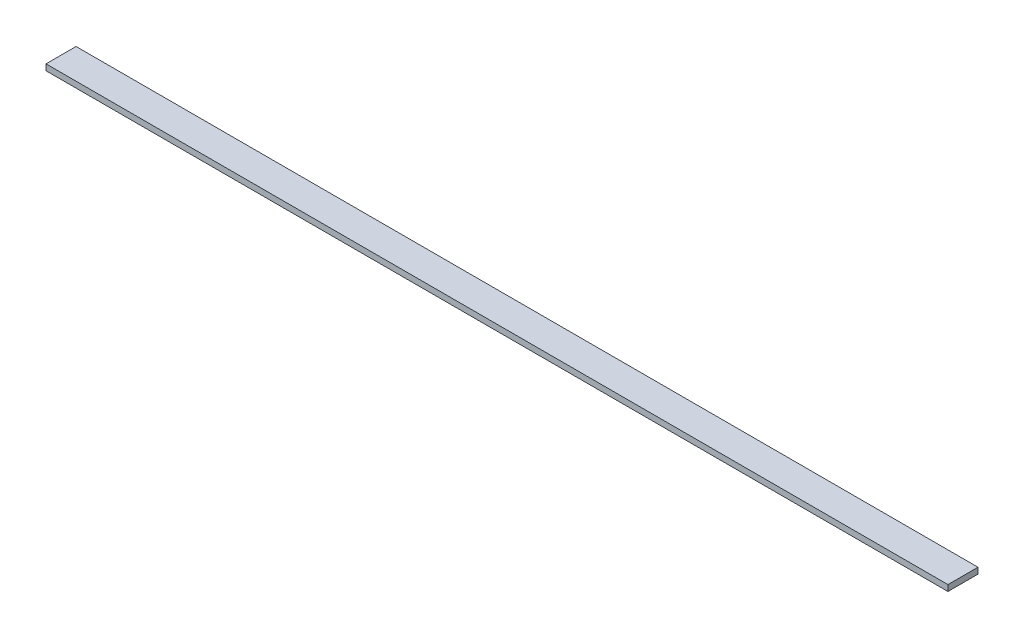
ISO-10303-21;
HEADER;
FILE_DESCRIPTION(('STEP AP214'),'2;1');
FILE_NAME('part.step','',(''),(''),'','','');
FILE_SCHEMA(('AUTOMOTIVE_DESIGN { 1 0 10303 214 1 1 1 1 }'));
ENDSEC;
DATA;
#1=APPLICATION_CONTEXT('core data for automotive mechanical design processes');
#2=APPLICATION_PROTOCOL_DEFINITION('international standard','automotive_design',2000,#1);
#3=PRODUCT_CONTEXT('',#1,'mechanical');
#4=PRODUCT('Part','Part','',(#3));
#5=PRODUCT_RELATED_PRODUCT_CATEGORY('part','',(#4));
#6=PRODUCT_DEFINITION_FORMATION('','',#4);
#7=PRODUCT_DEFINITION_CONTEXT('part definition',#1,'design');
#8=PRODUCT_DEFINITION('design','',#6,#7);
#9=PRODUCT_DEFINITION_SHAPE('','',#8);
#10=(LENGTH_UNIT() NAMED_UNIT(*) SI_UNIT(.MILLI.,.METRE.));
#11=(NAMED_UNIT(*) PLANE_ANGLE_UNIT() SI_UNIT($,.RADIAN.));
#12=(NAMED_UNIT(*) SI_UNIT($,.STERADIAN.) SOLID_ANGLE_UNIT());
#13=UNCERTAINTY_MEASURE_WITH_UNIT(LENGTH_MEASURE(1.E-05),#10,'distance_accuracy_value','');
#14=(GEOMETRIC_REPRESENTATION_CONTEXT(3) GLOBAL_UNCERTAINTY_ASSIGNED_CONTEXT((#13)) GLOBAL_UNIT_ASSIGNED_CONTEXT((#10,
#11,#12)) REPRESENTATION_CONTEXT('',''));
#15=CARTESIAN_POINT('',(0.,0.,0.));
#16=DIRECTION('',(0.,0.,1.));
#17=DIRECTION('',(1.,0.,0.));
#18=AXIS2_PLACEMENT_3D('',#15,#16,#17);
#19=CARTESIAN_POINT('',(300.,2.,10.));
#20=DIRECTION('',(-1.,0.,0.));
#21=DIRECTION('',(0.,0.,1.));
#22=AXIS2_PLACEMENT_3D('',#19,#20,#21);
#23=PLANE('',#22);
#24=DIRECTION('',(0.,0.,-1.));
#25=VECTOR('',#24,1.);
#26=CARTESIAN_POINT('',(300.,-2.,10.));
#27=LINE('',#26,#25);
#28=CARTESIAN_POINT('',(300.,-2.,10.));
#29=VERTEX_POINT('',#28);
#30=CARTESIAN_POINT('',(300.,-2.,-10.));
#31=VERTEX_POINT('',#30);
#32=EDGE_CURVE('E104',#29,#31,#27,.T.);
#33=ORIENTED_EDGE('',*,*,#32,.T.);
#34=DIRECTION('',(0.,-1.,0.));
#35=VECTOR('',#34,1.);
#36=CARTESIAN_POINT('',(300.,2.,-10.));
#37=LINE('',#36,#35);
#38=CARTESIAN_POINT('',(300.,2.,-10.));
#39=VERTEX_POINT('',#38);
#40=EDGE_CURVE('E11',#39,#31,#37,.T.);
#41=ORIENTED_EDGE('',*,*,#40,.F.);
#42=DIRECTION('',(0.,0.,-1.));
#43=VECTOR('',#42,1.);
#44=CARTESIAN_POINT('',(300.,2.,10.));
#45=LINE('',#44,#43);
#46=CARTESIAN_POINT('',(300.,2.,10.));
#47=VERTEX_POINT('',#46);
#48=EDGE_CURVE('E92',#47,#39,#45,.T.);
#49=ORIENTED_EDGE('',*,*,#48,.F.);
#50=DIRECTION('',(0.,-1.,0.));
#51=VECTOR('',#50,1.);
#52=CARTESIAN_POINT('',(300.,2.,10.));
#53=LINE('',#52,#51);
#54=EDGE_CURVE('E100',#47,#29,#53,.T.);
#55=ORIENTED_EDGE('',*,*,#54,.T.);
#56=EDGE_LOOP('',(#33,#41,#49,#55));
#57=FACE_BOUND('',#56,.T.);
#58=ADVANCED_FACE('F41',(#57),#23,.F.);
#59=CARTESIAN_POINT('',(-300.,2.,-10.));
#60=DIRECTION('',(0.,0.,1.));
#61=DIRECTION('',(1.,0.,0.));
#62=AXIS2_PLACEMENT_3D('',#59,#60,#61);
#63=PLANE('',#62);
#64=DIRECTION('',(-1.,0.,0.));
#65=VECTOR('',#64,1.);
#66=CARTESIAN_POINT('',(-300.,-2.,-10.));
#67=LINE('',#66,#65);
#68=CARTESIAN_POINT('',(-300.,-2.,-10.));
#69=VERTEX_POINT('',#68);
#70=EDGE_CURVE('E96',#31,#69,#67,.T.);
#71=ORIENTED_EDGE('',*,*,#70,.T.);
#72=DIRECTION('',(0.,-1.,0.));
#73=VECTOR('',#72,1.);
#74=CARTESIAN_POINT('',(-300.,2.,-10.));
#75=LINE('',#74,#73);
#76=CARTESIAN_POINT('',(-300.,2.,-10.));
#77=VERTEX_POINT('',#76);
#78=EDGE_CURVE('E49',#77,#69,#75,.T.);
#79=ORIENTED_EDGE('',*,*,#78,.F.);
#80=DIRECTION('',(-1.,0.,0.));
#81=VECTOR('',#80,1.);
#82=CARTESIAN_POINT('',(-300.,2.,-10.));
#83=LINE('',#82,#81);
#84=EDGE_CURVE('E87',#39,#77,#83,.T.);
#85=ORIENTED_EDGE('',*,*,#84,.F.);
#86=ORIENTED_EDGE('',*,*,#40,.T.);
#87=EDGE_LOOP('',(#71,#79,#85,#86));
#88=FACE_BOUND('',#87,.T.);
#89=ADVANCED_FACE('F95',(#88),#63,.F.);
#90=CARTESIAN_POINT('',(-300.,2.,10.));
#91=DIRECTION('',(1.,0.,0.));
#92=DIRECTION('',(0.,0.,-1.));
#93=AXIS2_PLACEMENT_3D('',#90,#91,#92);
#94=PLANE('',#93);
#95=DIRECTION('',(0.,0.,1.));
#96=VECTOR('',#95,1.);
#97=CARTESIAN_POINT('',(-300.,-2.,10.));
#98=LINE('',#97,#96);
#99=CARTESIAN_POINT('',(-300.,-2.,10.));
#100=VERTEX_POINT('',#99);
#101=EDGE_CURVE('E74',#69,#100,#98,.T.);
#102=ORIENTED_EDGE('',*,*,#101,.T.);
#103=DIRECTION('',(0.,-1.,0.));
#104=VECTOR('',#103,1.);
#105=CARTESIAN_POINT('',(-300.,2.,10.));
#106=LINE('',#105,#104);
#107=CARTESIAN_POINT('',(-300.,2.,10.));
#108=VERTEX_POINT('',#107);
#109=EDGE_CURVE('E97',#108,#100,#106,.T.);
#110=ORIENTED_EDGE('',*,*,#109,.F.);
#111=DIRECTION('',(0.,0.,1.));
#112=VECTOR('',#111,1.);
#113=CARTESIAN_POINT('',(-300.,2.,10.));
#114=LINE('',#113,#112);
#115=EDGE_CURVE('E90',#77,#108,#114,.T.);
#116=ORIENTED_EDGE('',*,*,#115,.F.);
#117=ORIENTED_EDGE('',*,*,#78,.T.);
#118=EDGE_LOOP('',(#102,#110,#116,#117));
#119=FACE_BOUND('',#118,.T.);
#120=ADVANCED_FACE('F98',(#119),#94,.F.);
#121=CARTESIAN_POINT('',(-300.,2.,10.));
#122=DIRECTION('',(0.,0.,-1.));
#123=DIRECTION('',(-1.,0.,0.));
#124=AXIS2_PLACEMENT_3D('',#121,#122,#123);
#125=PLANE('',#124);
#126=DIRECTION('',(1.,0.,0.));
#127=VECTOR('',#126,1.);
#128=CARTESIAN_POINT('',(-300.,-2.,10.));
#129=LINE('',#128,#127);
#130=EDGE_CURVE('E80',#100,#29,#129,.T.);
#131=ORIENTED_EDGE('',*,*,#130,.T.);
#132=ORIENTED_EDGE('',*,*,#54,.F.);
#133=DIRECTION('',(1.,0.,0.));
#134=VECTOR('',#133,1.);
#135=CARTESIAN_POINT('',(-300.,2.,10.));
#136=LINE('',#135,#134);
#137=EDGE_CURVE('E57',#108,#47,#136,.T.);
#138=ORIENTED_EDGE('',*,*,#137,.F.);
#139=ORIENTED_EDGE('',*,*,#109,.T.);
#140=EDGE_LOOP('',(#131,#132,#138,#139));
#141=FACE_BOUND('',#140,.T.);
#142=ADVANCED_FACE('F111',(#141),#125,.F.);
#143=CARTESIAN_POINT('',(0.,2.,0.));
#144=DIRECTION('',(0.,-1.,0.));
#145=DIRECTION('',(0.,0.,-1.));
#146=AXIS2_PLACEMENT_3D('',#143,#144,#145);
#147=PLANE('',#146);
#148=ORIENTED_EDGE('',*,*,#48,.T.);
#149=ORIENTED_EDGE('',*,*,#84,.T.);
#150=ORIENTED_EDGE('',*,*,#115,.T.);
#151=ORIENTED_EDGE('',*,*,#137,.T.);
#152=EDGE_LOOP('',(#148,#149,#150,#151));
#153=FACE_BOUND('',#152,.T.);
#154=ADVANCED_FACE('F88',(#153),#147,.F.);
#155=CARTESIAN_POINT('',(0.,-2.,0.));
#156=DIRECTION('',(0.,-1.,0.));
#157=DIRECTION('',(0.,0.,-1.));
#158=AXIS2_PLACEMENT_3D('',#155,#156,#157);
#159=PLANE('',#158);
#160=ORIENTED_EDGE('',*,*,#32,.F.);
#161=ORIENTED_EDGE('',*,*,#130,.F.);
#162=ORIENTED_EDGE('',*,*,#101,.F.);
#163=ORIENTED_EDGE('',*,*,#70,.F.);
#164=EDGE_LOOP('',(#160,#161,#162,#163));
#165=FACE_BOUND('',#164,.T.);
#166=ADVANCED_FACE('F114',(#165),#159,.T.);
#167=CLOSED_SHELL('',(#58,#89,#120,#142,#154,#166));
#168=MANIFOLD_SOLID_BREP('B2',#167);
#169=ADVANCED_BREP_SHAPE_REPRESENTATION('',(#18,#168),#14);
#170=SHAPE_DEFINITION_REPRESENTATION(#9,#169);
ENDSEC;
END-ISO-10303-21;
